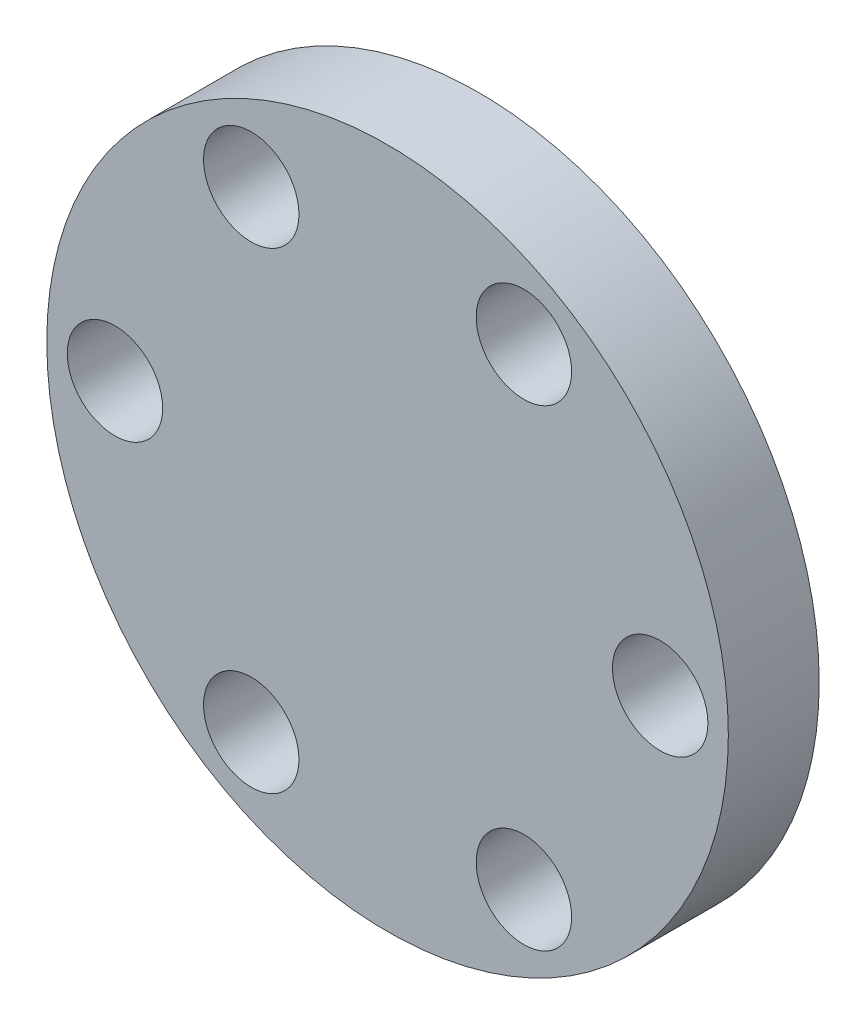
ISO-10303-21;
HEADER;
FILE_DESCRIPTION(('STEP AP214'),'2;1');
FILE_NAME('part.step','',(''),(''),'','','');
FILE_SCHEMA(('AUTOMOTIVE_DESIGN { 1 0 10303 214 1 1 1 1 }'));
ENDSEC;
DATA;
#1=APPLICATION_CONTEXT('core data for automotive mechanical design processes');
#2=APPLICATION_PROTOCOL_DEFINITION('international standard','automotive_design',2000,#1);
#3=PRODUCT_CONTEXT('',#1,'mechanical');
#4=PRODUCT('Part','Part','',(#3));
#5=PRODUCT_RELATED_PRODUCT_CATEGORY('part','',(#4));
#6=PRODUCT_DEFINITION_FORMATION('','',#4);
#7=PRODUCT_DEFINITION_CONTEXT('part definition',#1,'design');
#8=PRODUCT_DEFINITION('design','',#6,#7);
#9=PRODUCT_DEFINITION_SHAPE('','',#8);
#10=(LENGTH_UNIT() NAMED_UNIT(*) SI_UNIT(.MILLI.,.METRE.));
#11=(NAMED_UNIT(*) PLANE_ANGLE_UNIT() SI_UNIT($,.RADIAN.));
#12=(NAMED_UNIT(*) SI_UNIT($,.STERADIAN.) SOLID_ANGLE_UNIT());
#13=UNCERTAINTY_MEASURE_WITH_UNIT(LENGTH_MEASURE(1.E-05),#10,'distance_accuracy_value','');
#14=(GEOMETRIC_REPRESENTATION_CONTEXT(3) GLOBAL_UNCERTAINTY_ASSIGNED_CONTEXT((#13)) GLOBAL_UNIT_ASSIGNED_CONTEXT((#10,
#11,#12)) REPRESENTATION_CONTEXT('',''));
#15=CARTESIAN_POINT('',(0.,0.,0.));
#16=DIRECTION('',(0.,0.,1.));
#17=DIRECTION('',(1.,0.,0.));
#18=AXIS2_PLACEMENT_3D('',#15,#16,#17);
#19=CARTESIAN_POINT('',(0.,0.,2.));
#20=DIRECTION('',(0.,0.,1.));
#21=DIRECTION('',(1.,0.,0.));
#22=AXIS2_PLACEMENT_3D('',#19,#20,#21);
#23=PLANE('',#22);
#24=CARTESIAN_POINT('',(6.00000000000001,-10.3923048454133,2.));
#25=DIRECTION('',(0.,0.,1.));
#26=DIRECTION('',(1.,0.,0.));
#27=AXIS2_PLACEMENT_3D('',#24,#25,#26);
#28=CIRCLE('',#27,2.1);
#29=CARTESIAN_POINT('',(8.10000000000001,-10.3923048454133,2.));
#30=VERTEX_POINT('',#29);
#31=EDGE_CURVE('E86',#30,#30,#28,.T.);
#32=ORIENTED_EDGE('',*,*,#31,.F.);
#33=EDGE_LOOP('',(#32));
#34=FACE_BOUND('',#33,.T.);
#35=CARTESIAN_POINT('',(6.,10.3923048454133,2.));
#36=DIRECTION('',(0.,0.,1.));
#37=DIRECTION('',(1.,0.,0.));
#38=AXIS2_PLACEMENT_3D('',#35,#36,#37);
#39=CIRCLE('',#38,2.1);
#40=CARTESIAN_POINT('',(8.1,10.3923048454133,2.));
#41=VERTEX_POINT('',#40);
#42=EDGE_CURVE('E68',#41,#41,#39,.T.);
#43=ORIENTED_EDGE('',*,*,#42,.F.);
#44=EDGE_LOOP('',(#43));
#45=FACE_BOUND('',#44,.T.);
#46=CARTESIAN_POINT('',(-12.,0.,2.));
#47=DIRECTION('',(0.,0.,1.));
#48=DIRECTION('',(1.,0.,0.));
#49=AXIS2_PLACEMENT_3D('',#46,#47,#48);
#50=CIRCLE('',#49,2.1);
#51=CARTESIAN_POINT('',(-9.9,0.,2.));
#52=VERTEX_POINT('',#51);
#53=EDGE_CURVE('E57',#52,#52,#50,.T.);
#54=ORIENTED_EDGE('',*,*,#53,.F.);
#55=EDGE_LOOP('',(#54));
#56=FACE_BOUND('',#55,.T.);
#57=CARTESIAN_POINT('',(0.,0.,2.));
#58=DIRECTION('',(0.,0.,1.));
#59=DIRECTION('',(1.,0.,0.));
#60=AXIS2_PLACEMENT_3D('',#57,#58,#59);
#61=CIRCLE('',#60,15.);
#62=CARTESIAN_POINT('',(15.,0.,2.));
#63=VERTEX_POINT('',#62);
#64=EDGE_CURVE('E10',#63,#63,#61,.T.);
#65=ORIENTED_EDGE('',*,*,#64,.T.);
#66=EDGE_LOOP('',(#65));
#67=FACE_BOUND('',#66,.T.);
#68=CARTESIAN_POINT('',(-6.,10.3923048454133,2.));
#69=DIRECTION('',(0.,0.,1.));
#70=DIRECTION('',(1.,0.,0.));
#71=AXIS2_PLACEMENT_3D('',#68,#69,#70);
#72=CIRCLE('',#71,2.1);
#73=CARTESIAN_POINT('',(-3.9,10.3923048454133,2.));
#74=VERTEX_POINT('',#73);
#75=EDGE_CURVE('E62',#74,#74,#72,.T.);
#76=ORIENTED_EDGE('',*,*,#75,.F.);
#77=EDGE_LOOP('',(#76));
#78=FACE_BOUND('',#77,.T.);
#79=CARTESIAN_POINT('',(12.,0.,2.));
#80=DIRECTION('',(0.,0.,1.));
#81=DIRECTION('',(1.,0.,0.));
#82=AXIS2_PLACEMENT_3D('',#79,#80,#81);
#83=CIRCLE('',#82,2.1);
#84=CARTESIAN_POINT('',(14.1,0.,2.));
#85=VERTEX_POINT('',#84);
#86=EDGE_CURVE('E76',#85,#85,#83,.T.);
#87=ORIENTED_EDGE('',*,*,#86,.F.);
#88=EDGE_LOOP('',(#87));
#89=FACE_BOUND('',#88,.T.);
#90=CARTESIAN_POINT('',(-6.,-10.3923048454133,2.));
#91=DIRECTION('',(0.,0.,1.));
#92=DIRECTION('',(1.,0.,0.));
#93=AXIS2_PLACEMENT_3D('',#90,#91,#92);
#94=CIRCLE('',#93,2.1);
#95=CARTESIAN_POINT('',(-3.9,-10.3923048454133,2.));
#96=VERTEX_POINT('',#95);
#97=EDGE_CURVE('E92',#96,#96,#94,.T.);
#98=ORIENTED_EDGE('',*,*,#97,.F.);
#99=EDGE_LOOP('',(#98));
#100=FACE_BOUND('',#99,.T.);
#101=ADVANCED_FACE('F43',(#34,#45,#56,#67,#78,#89,#100),#23,.T.);
#102=CARTESIAN_POINT('',(0.,0.,-2.));
#103=DIRECTION('',(0.,0.,1.));
#104=DIRECTION('',(1.,0.,0.));
#105=AXIS2_PLACEMENT_3D('',#102,#103,#104);
#106=PLANE('',#105);
#107=CARTESIAN_POINT('',(0.,0.,-2.));
#108=DIRECTION('',(0.,0.,1.));
#109=DIRECTION('',(1.,0.,0.));
#110=AXIS2_PLACEMENT_3D('',#107,#108,#109);
#111=CIRCLE('',#110,15.);
#112=CARTESIAN_POINT('',(15.,0.,-2.));
#113=VERTEX_POINT('',#112);
#114=EDGE_CURVE('E50',#113,#113,#111,.T.);
#115=ORIENTED_EDGE('',*,*,#114,.F.);
#116=EDGE_LOOP('',(#115));
#117=FACE_BOUND('',#116,.T.);
#118=CARTESIAN_POINT('',(-12.,0.,-2.));
#119=DIRECTION('',(0.,0.,1.));
#120=DIRECTION('',(1.,0.,0.));
#121=AXIS2_PLACEMENT_3D('',#118,#119,#120);
#122=CIRCLE('',#121,2.1);
#123=CARTESIAN_POINT('',(-9.9,0.,-2.));
#124=VERTEX_POINT('',#123);
#125=EDGE_CURVE('E59',#124,#124,#122,.T.);
#126=ORIENTED_EDGE('',*,*,#125,.T.);
#127=EDGE_LOOP('',(#126));
#128=FACE_BOUND('',#127,.T.);
#129=CARTESIAN_POINT('',(-6.,10.3923048454133,-2.));
#130=DIRECTION('',(0.,0.,1.));
#131=DIRECTION('',(1.,0.,0.));
#132=AXIS2_PLACEMENT_3D('',#129,#130,#131);
#133=CIRCLE('',#132,2.1);
#134=CARTESIAN_POINT('',(-3.9,10.3923048454133,-2.));
#135=VERTEX_POINT('',#134);
#136=EDGE_CURVE('E67',#135,#135,#133,.T.);
#137=ORIENTED_EDGE('',*,*,#136,.T.);
#138=EDGE_LOOP('',(#137));
#139=FACE_BOUND('',#138,.T.);
#140=CARTESIAN_POINT('',(6.,10.3923048454133,-2.));
#141=DIRECTION('',(0.,0.,1.));
#142=DIRECTION('',(1.,0.,0.));
#143=AXIS2_PLACEMENT_3D('',#140,#141,#142);
#144=CIRCLE('',#143,2.1);
#145=CARTESIAN_POINT('',(8.1,10.3923048454133,-2.));
#146=VERTEX_POINT('',#145);
#147=EDGE_CURVE('E73',#146,#146,#144,.T.);
#148=ORIENTED_EDGE('',*,*,#147,.T.);
#149=EDGE_LOOP('',(#148));
#150=FACE_BOUND('',#149,.T.);
#151=CARTESIAN_POINT('',(12.,0.,-2.));
#152=DIRECTION('',(0.,0.,1.));
#153=DIRECTION('',(1.,0.,0.));
#154=AXIS2_PLACEMENT_3D('',#151,#152,#153);
#155=CIRCLE('',#154,2.1);
#156=CARTESIAN_POINT('',(14.1,0.,-2.));
#157=VERTEX_POINT('',#156);
#158=EDGE_CURVE('E85',#157,#157,#155,.T.);
#159=ORIENTED_EDGE('',*,*,#158,.T.);
#160=EDGE_LOOP('',(#159));
#161=FACE_BOUND('',#160,.T.);
#162=CARTESIAN_POINT('',(6.00000000000001,-10.3923048454133,-2.));
#163=DIRECTION('',(0.,0.,1.));
#164=DIRECTION('',(1.,0.,0.));
#165=AXIS2_PLACEMENT_3D('',#162,#163,#164);
#166=CIRCLE('',#165,2.1);
#167=CARTESIAN_POINT('',(8.10000000000001,-10.3923048454133,-2.));
#168=VERTEX_POINT('',#167);
#169=EDGE_CURVE('E89',#168,#168,#166,.T.);
#170=ORIENTED_EDGE('',*,*,#169,.T.);
#171=EDGE_LOOP('',(#170));
#172=FACE_BOUND('',#171,.T.);
#173=CARTESIAN_POINT('',(-6.,-10.3923048454133,-2.));
#174=DIRECTION('',(0.,0.,1.));
#175=DIRECTION('',(1.,0.,0.));
#176=AXIS2_PLACEMENT_3D('',#173,#174,#175);
#177=CIRCLE('',#176,2.1);
#178=CARTESIAN_POINT('',(-3.9,-10.3923048454133,-2.));
#179=VERTEX_POINT('',#178);
#180=EDGE_CURVE('E97',#179,#179,#177,.T.);
#181=ORIENTED_EDGE('',*,*,#180,.T.);
#182=EDGE_LOOP('',(#181));
#183=FACE_BOUND('',#182,.T.);
#184=ADVANCED_FACE('F110',(#117,#128,#139,#150,#161,#172,#183),#106,.F.);
#185=CARTESIAN_POINT('',(0.,0.,2.));
#186=DIRECTION('',(0.,0.,-1.));
#187=DIRECTION('',(-1.,0.,0.));
#188=AXIS2_PLACEMENT_3D('',#185,#186,#187);
#189=CYLINDRICAL_SURFACE('',#188,15.);
#190=ORIENTED_EDGE('',*,*,#64,.F.);
#191=EDGE_LOOP('',(#190));
#192=FACE_BOUND('',#191,.T.);
#193=ORIENTED_EDGE('',*,*,#114,.T.);
#194=EDGE_LOOP('',(#193));
#195=FACE_BOUND('',#194,.T.);
#196=ADVANCED_FACE('F44',(#192,#195),#189,.T.);
#197=CARTESIAN_POINT('',(-12.,0.,2.));
#198=DIRECTION('',(0.,0.,-1.));
#199=DIRECTION('',(-1.,0.,0.));
#200=AXIS2_PLACEMENT_3D('',#197,#198,#199);
#201=CYLINDRICAL_SURFACE('',#200,2.1);
#202=ORIENTED_EDGE('',*,*,#53,.T.);
#203=EDGE_LOOP('',(#202));
#204=FACE_BOUND('',#203,.T.);
#205=ORIENTED_EDGE('',*,*,#125,.F.);
#206=EDGE_LOOP('',(#205));
#207=FACE_BOUND('',#206,.T.);
#208=ADVANCED_FACE('F120',(#204,#207),#201,.F.);
#209=CARTESIAN_POINT('',(-6.,10.3923048454133,2.));
#210=DIRECTION('',(0.,0.,-1.));
#211=DIRECTION('',(-1.,0.,0.));
#212=AXIS2_PLACEMENT_3D('',#209,#210,#211);
#213=CYLINDRICAL_SURFACE('',#212,2.1);
#214=ORIENTED_EDGE('',*,*,#75,.T.);
#215=EDGE_LOOP('',(#214));
#216=FACE_BOUND('',#215,.T.);
#217=ORIENTED_EDGE('',*,*,#136,.F.);
#218=EDGE_LOOP('',(#217));
#219=FACE_BOUND('',#218,.T.);
#220=ADVANCED_FACE('F121',(#216,#219),#213,.F.);
#221=CARTESIAN_POINT('',(6.,10.3923048454133,2.));
#222=DIRECTION('',(0.,0.,-1.));
#223=DIRECTION('',(-1.,0.,0.));
#224=AXIS2_PLACEMENT_3D('',#221,#222,#223);
#225=CYLINDRICAL_SURFACE('',#224,2.1);
#226=ORIENTED_EDGE('',*,*,#42,.T.);
#227=EDGE_LOOP('',(#226));
#228=FACE_BOUND('',#227,.T.);
#229=ORIENTED_EDGE('',*,*,#147,.F.);
#230=EDGE_LOOP('',(#229));
#231=FACE_BOUND('',#230,.T.);
#232=ADVANCED_FACE('F130',(#228,#231),#225,.F.);
#233=CARTESIAN_POINT('',(12.,0.,2.));
#234=DIRECTION('',(0.,0.,-1.));
#235=DIRECTION('',(-1.,0.,0.));
#236=AXIS2_PLACEMENT_3D('',#233,#234,#235);
#237=CYLINDRICAL_SURFACE('',#236,2.1);
#238=ORIENTED_EDGE('',*,*,#86,.T.);
#239=EDGE_LOOP('',(#238));
#240=FACE_BOUND('',#239,.T.);
#241=ORIENTED_EDGE('',*,*,#158,.F.);
#242=EDGE_LOOP('',(#241));
#243=FACE_BOUND('',#242,.T.);
#244=ADVANCED_FACE('F131',(#240,#243),#237,.F.);
#245=CARTESIAN_POINT('',(6.00000000000001,-10.3923048454133,2.));
#246=DIRECTION('',(0.,0.,-1.));
#247=DIRECTION('',(-1.,0.,0.));
#248=AXIS2_PLACEMENT_3D('',#245,#246,#247);
#249=CYLINDRICAL_SURFACE('',#248,2.1);
#250=ORIENTED_EDGE('',*,*,#31,.T.);
#251=EDGE_LOOP('',(#250));
#252=FACE_BOUND('',#251,.T.);
#253=ORIENTED_EDGE('',*,*,#169,.F.);
#254=EDGE_LOOP('',(#253));
#255=FACE_BOUND('',#254,.T.);
#256=ADVANCED_FACE('F134',(#252,#255),#249,.F.);
#257=CARTESIAN_POINT('',(-6.,-10.3923048454133,2.));
#258=DIRECTION('',(0.,0.,-1.));
#259=DIRECTION('',(-1.,0.,0.));
#260=AXIS2_PLACEMENT_3D('',#257,#258,#259);
#261=CYLINDRICAL_SURFACE('',#260,2.1);
#262=ORIENTED_EDGE('',*,*,#97,.T.);
#263=EDGE_LOOP('',(#262));
#264=FACE_BOUND('',#263,.T.);
#265=ORIENTED_EDGE('',*,*,#180,.F.);
#266=EDGE_LOOP('',(#265));
#267=FACE_BOUND('',#266,.T.);
#268=ADVANCED_FACE('F106',(#264,#267),#261,.F.);
#269=CLOSED_SHELL('',(#101,#184,#196,#208,#220,#232,#244,#256,#268));
#270=MANIFOLD_SOLID_BREP('B2',#269);
#271=ADVANCED_BREP_SHAPE_REPRESENTATION('',(#18,#270),#14);
#272=SHAPE_DEFINITION_REPRESENTATION(#9,#271);
ENDSEC;
END-ISO-10303-21;
